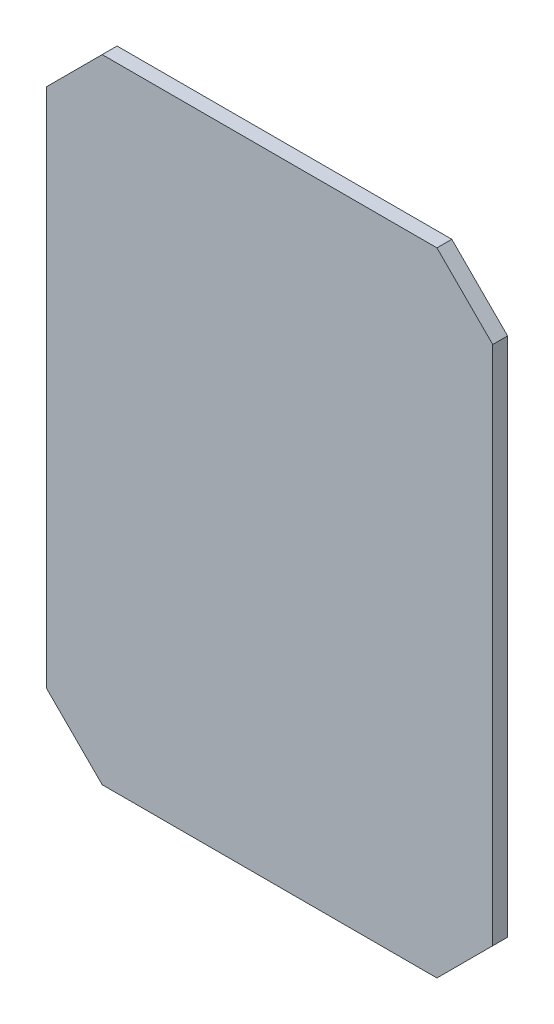
ISO-10303-21;
HEADER;
FILE_DESCRIPTION(('STEP AP214'),'2;1');
FILE_NAME('part.step','',(''),(''),'','','');
FILE_SCHEMA(('AUTOMOTIVE_DESIGN { 1 0 10303 214 1 1 1 1 }'));
ENDSEC;
DATA;
#1=APPLICATION_CONTEXT('core data for automotive mechanical design processes');
#2=APPLICATION_PROTOCOL_DEFINITION('international standard','automotive_design',2000,#1);
#3=PRODUCT_CONTEXT('',#1,'mechanical');
#4=PRODUCT('Part','Part','',(#3));
#5=PRODUCT_RELATED_PRODUCT_CATEGORY('part','',(#4));
#6=PRODUCT_DEFINITION_FORMATION('','',#4);
#7=PRODUCT_DEFINITION_CONTEXT('part definition',#1,'design');
#8=PRODUCT_DEFINITION('design','',#6,#7);
#9=PRODUCT_DEFINITION_SHAPE('','',#8);
#10=(LENGTH_UNIT() NAMED_UNIT(*) SI_UNIT(.MILLI.,.METRE.));
#11=(NAMED_UNIT(*) PLANE_ANGLE_UNIT() SI_UNIT($,.RADIAN.));
#12=(NAMED_UNIT(*) SI_UNIT($,.STERADIAN.) SOLID_ANGLE_UNIT());
#13=UNCERTAINTY_MEASURE_WITH_UNIT(LENGTH_MEASURE(1.E-05),#10,'distance_accuracy_value','');
#14=(GEOMETRIC_REPRESENTATION_CONTEXT(3) GLOBAL_UNCERTAINTY_ASSIGNED_CONTEXT((#13)) GLOBAL_UNIT_ASSIGNED_CONTEXT((#10,
#11,#12)) REPRESENTATION_CONTEXT('',''));
#15=CARTESIAN_POINT('',(0.,0.,0.));
#16=DIRECTION('',(0.,0.,1.));
#17=DIRECTION('',(1.,0.,0.));
#18=AXIS2_PLACEMENT_3D('',#15,#16,#17);
#19=CARTESIAN_POINT('',(-95.9078770659767,78.0205879464951,8.));
#20=DIRECTION('',(-0.707106781186547,0.707106781186547,0.));
#21=DIRECTION('',(-0.707106781186548,-0.707106781186548,0.));
#22=AXIS2_PLACEMENT_3D('',#19,#20,#21);
#23=PLANE('',#22);
#24=DIRECTION('',(0.707106781186547,0.707106781186547,0.));
#25=VECTOR('',#24,1.);
#26=CARTESIAN_POINT('',(-95.9078770659767,78.0205879464951,0.));
#27=LINE('',#26,#25);
#28=CARTESIAN_POINT('',(-95.9078770659767,78.0205879464951,0.));
#29=VERTEX_POINT('',#28);
#30=CARTESIAN_POINT('',(-65.9078770659767,108.020587946495,0.));
#31=VERTEX_POINT('',#30);
#32=EDGE_CURVE('E135',#29,#31,#27,.T.);
#33=ORIENTED_EDGE('',*,*,#32,.F.);
#34=DIRECTION('',(0.,0.,-1.));
#35=VECTOR('',#34,1.);
#36=CARTESIAN_POINT('',(-95.9078770659767,78.0205879464951,8.));
#37=LINE('',#36,#35);
#38=CARTESIAN_POINT('',(-95.9078770659767,78.0205879464951,8.));
#39=VERTEX_POINT('',#38);
#40=EDGE_CURVE('E11',#39,#29,#37,.T.);
#41=ORIENTED_EDGE('',*,*,#40,.F.);
#42=DIRECTION('',(0.707106781186547,0.707106781186547,0.));
#43=VECTOR('',#42,1.);
#44=CARTESIAN_POINT('',(-95.9078770659767,78.0205879464951,8.));
#45=LINE('',#44,#43);
#46=CARTESIAN_POINT('',(-65.9078770659767,108.020587946495,8.));
#47=VERTEX_POINT('',#46);
#48=EDGE_CURVE('E153',#39,#47,#45,.T.);
#49=ORIENTED_EDGE('',*,*,#48,.T.);
#50=DIRECTION('',(0.,0.,-1.));
#51=VECTOR('',#50,1.);
#52=CARTESIAN_POINT('',(-65.9078770659767,108.020587946495,8.));
#53=LINE('',#52,#51);
#54=EDGE_CURVE('E39',#47,#31,#53,.T.);
#55=ORIENTED_EDGE('',*,*,#54,.T.);
#56=EDGE_LOOP('',(#33,#41,#49,#55));
#57=FACE_BOUND('',#56,.T.);
#58=ADVANCED_FACE('F36',(#57),#23,.T.);
#59=CARTESIAN_POINT('',(-95.9078770659767,78.0205879464951,8.));
#60=DIRECTION('',(1.,0.,0.));
#61=DIRECTION('',(0.,1.,0.));
#62=AXIS2_PLACEMENT_3D('',#59,#60,#61);
#63=PLANE('',#62);
#64=DIRECTION('',(0.,-1.,0.));
#65=VECTOR('',#64,1.);
#66=CARTESIAN_POINT('',(-95.9078770659767,78.0205879464951,0.));
#67=LINE('',#66,#65);
#68=CARTESIAN_POINT('',(-95.9078770659767,-201.979412053505,0.));
#69=VERTEX_POINT('',#68);
#70=EDGE_CURVE('E81',#29,#69,#67,.T.);
#71=ORIENTED_EDGE('',*,*,#70,.T.);
#72=DIRECTION('',(0.,0.,-1.));
#73=VECTOR('',#72,1.);
#74=CARTESIAN_POINT('',(-95.9078770659767,-201.979412053505,8.));
#75=LINE('',#74,#73);
#76=CARTESIAN_POINT('',(-95.9078770659767,-201.979412053505,8.));
#77=VERTEX_POINT('',#76);
#78=EDGE_CURVE('E45',#77,#69,#75,.T.);
#79=ORIENTED_EDGE('',*,*,#78,.F.);
#80=DIRECTION('',(0.,-1.,0.));
#81=VECTOR('',#80,1.);
#82=CARTESIAN_POINT('',(-95.9078770659767,78.0205879464951,8.));
#83=LINE('',#82,#81);
#84=EDGE_CURVE('E113',#39,#77,#83,.T.);
#85=ORIENTED_EDGE('',*,*,#84,.F.);
#86=ORIENTED_EDGE('',*,*,#40,.T.);
#87=EDGE_LOOP('',(#71,#79,#85,#86));
#88=FACE_BOUND('',#87,.T.);
#89=ADVANCED_FACE('F190',(#88),#63,.F.);
#90=CARTESIAN_POINT('',(-95.9078770659767,-201.979412053505,8.));
#91=DIRECTION('',(0.707106781186547,0.707106781186547,0.));
#92=DIRECTION('',(-0.707106781186548,0.707106781186548,0.));
#93=AXIS2_PLACEMENT_3D('',#90,#91,#92);
#94=PLANE('',#93);
#95=DIRECTION('',(0.707106781186547,-0.707106781186547,0.));
#96=VECTOR('',#95,1.);
#97=CARTESIAN_POINT('',(-95.9078770659767,-201.979412053505,0.));
#98=LINE('',#97,#96);
#99=CARTESIAN_POINT('',(-65.9078770659767,-231.979412053505,0.));
#100=VERTEX_POINT('',#99);
#101=EDGE_CURVE('E120',#69,#100,#98,.T.);
#102=ORIENTED_EDGE('',*,*,#101,.T.);
#103=DIRECTION('',(0.,0.,-1.));
#104=VECTOR('',#103,1.);
#105=CARTESIAN_POINT('',(-65.9078770659767,-231.979412053505,8.));
#106=LINE('',#105,#104);
#107=CARTESIAN_POINT('',(-65.9078770659767,-231.979412053505,8.));
#108=VERTEX_POINT('',#107);
#109=EDGE_CURVE('E117',#108,#100,#106,.T.);
#110=ORIENTED_EDGE('',*,*,#109,.F.);
#111=DIRECTION('',(0.707106781186547,-0.707106781186547,0.));
#112=VECTOR('',#111,1.);
#113=CARTESIAN_POINT('',(-95.9078770659767,-201.979412053505,8.));
#114=LINE('',#113,#112);
#115=EDGE_CURVE('E105',#77,#108,#114,.T.);
#116=ORIENTED_EDGE('',*,*,#115,.F.);
#117=ORIENTED_EDGE('',*,*,#78,.T.);
#118=EDGE_LOOP('',(#102,#110,#116,#117));
#119=FACE_BOUND('',#118,.T.);
#120=ADVANCED_FACE('F118',(#119),#94,.F.);
#121=CARTESIAN_POINT('',(-65.9078770659767,-231.979412053505,8.));
#122=DIRECTION('',(0.,1.,0.));
#123=DIRECTION('',(-1.,0.,0.));
#124=AXIS2_PLACEMENT_3D('',#121,#122,#123);
#125=PLANE('',#124);
#126=DIRECTION('',(1.,0.,0.));
#127=VECTOR('',#126,1.);
#128=CARTESIAN_POINT('',(-65.9078770659767,-231.979412053505,0.));
#129=LINE('',#128,#127);
#130=CARTESIAN_POINT('',(114.092122934023,-231.979412053505,0.));
#131=VERTEX_POINT('',#130);
#132=EDGE_CURVE('E150',#100,#131,#129,.T.);
#133=ORIENTED_EDGE('',*,*,#132,.T.);
#134=DIRECTION('',(0.,0.,-1.));
#135=VECTOR('',#134,1.);
#136=CARTESIAN_POINT('',(114.092122934023,-231.979412053505,8.));
#137=LINE('',#136,#135);
#138=CARTESIAN_POINT('',(114.092122934023,-231.979412053505,8.));
#139=VERTEX_POINT('',#138);
#140=EDGE_CURVE('E124',#139,#131,#137,.T.);
#141=ORIENTED_EDGE('',*,*,#140,.F.);
#142=DIRECTION('',(1.,0.,0.));
#143=VECTOR('',#142,1.);
#144=CARTESIAN_POINT('',(-65.9078770659767,-231.979412053505,8.));
#145=LINE('',#144,#143);
#146=EDGE_CURVE('E111',#108,#139,#145,.T.);
#147=ORIENTED_EDGE('',*,*,#146,.F.);
#148=ORIENTED_EDGE('',*,*,#109,.T.);
#149=EDGE_LOOP('',(#133,#141,#147,#148));
#150=FACE_BOUND('',#149,.T.);
#151=ADVANCED_FACE('F126',(#150),#125,.F.);
#152=CARTESIAN_POINT('',(144.092122934023,-201.979412053505,8.));
#153=DIRECTION('',(0.707106781186547,-0.707106781186547,0.));
#154=DIRECTION('',(0.707106781186548,0.707106781186548,0.));
#155=AXIS2_PLACEMENT_3D('',#152,#153,#154);
#156=PLANE('',#155);
#157=DIRECTION('',(-0.707106781186547,-0.707106781186547,0.));
#158=VECTOR('',#157,1.);
#159=CARTESIAN_POINT('',(144.092122934023,-201.979412053505,0.));
#160=LINE('',#159,#158);
#161=CARTESIAN_POINT('',(144.092122934023,-201.979412053505,0.));
#162=VERTEX_POINT('',#161);
#163=EDGE_CURVE('E147',#162,#131,#160,.T.);
#164=ORIENTED_EDGE('',*,*,#163,.F.);
#165=DIRECTION('',(0.,0.,-1.));
#166=VECTOR('',#165,1.);
#167=CARTESIAN_POINT('',(144.092122934023,-201.979412053505,8.));
#168=LINE('',#167,#166);
#169=CARTESIAN_POINT('',(144.092122934023,-201.979412053505,8.));
#170=VERTEX_POINT('',#169);
#171=EDGE_CURVE('E157',#170,#162,#168,.T.);
#172=ORIENTED_EDGE('',*,*,#171,.F.);
#173=DIRECTION('',(-0.707106781186547,-0.707106781186547,0.));
#174=VECTOR('',#173,1.);
#175=CARTESIAN_POINT('',(144.092122934023,-201.979412053505,8.));
#176=LINE('',#175,#174);
#177=EDGE_CURVE('E128',#170,#139,#176,.T.);
#178=ORIENTED_EDGE('',*,*,#177,.T.);
#179=ORIENTED_EDGE('',*,*,#140,.T.);
#180=EDGE_LOOP('',(#164,#172,#178,#179));
#181=FACE_BOUND('',#180,.T.);
#182=ADVANCED_FACE('F168',(#181),#156,.T.);
#183=CARTESIAN_POINT('',(144.092122934023,78.0205879464951,8.));
#184=DIRECTION('',(1.,0.,0.));
#185=DIRECTION('',(0.,1.,0.));
#186=AXIS2_PLACEMENT_3D('',#183,#184,#185);
#187=PLANE('',#186);
#188=DIRECTION('',(0.,-1.,0.));
#189=VECTOR('',#188,1.);
#190=CARTESIAN_POINT('',(144.092122934023,78.0205879464951,0.));
#191=LINE('',#190,#189);
#192=CARTESIAN_POINT('',(144.092122934023,78.0205879464951,0.));
#193=VERTEX_POINT('',#192);
#194=EDGE_CURVE('E144',#193,#162,#191,.T.);
#195=ORIENTED_EDGE('',*,*,#194,.F.);
#196=DIRECTION('',(0.,0.,-1.));
#197=VECTOR('',#196,1.);
#198=CARTESIAN_POINT('',(144.092122934023,78.0205879464951,8.));
#199=LINE('',#198,#197);
#200=CARTESIAN_POINT('',(144.092122934023,78.0205879464951,8.));
#201=VERTEX_POINT('',#200);
#202=EDGE_CURVE('E159',#201,#193,#199,.T.);
#203=ORIENTED_EDGE('',*,*,#202,.F.);
#204=DIRECTION('',(0.,-1.,0.));
#205=VECTOR('',#204,1.);
#206=CARTESIAN_POINT('',(144.092122934023,78.0205879464951,8.));
#207=LINE('',#206,#205);
#208=EDGE_CURVE('E130',#201,#170,#207,.T.);
#209=ORIENTED_EDGE('',*,*,#208,.T.);
#210=ORIENTED_EDGE('',*,*,#171,.T.);
#211=EDGE_LOOP('',(#195,#203,#209,#210));
#212=FACE_BOUND('',#211,.T.);
#213=ADVANCED_FACE('F174',(#212),#187,.T.);
#214=CARTESIAN_POINT('',(114.092122934023,108.020587946495,8.));
#215=DIRECTION('',(0.707106781186547,0.707106781186547,0.));
#216=DIRECTION('',(-0.707106781186548,0.707106781186548,0.));
#217=AXIS2_PLACEMENT_3D('',#214,#215,#216);
#218=PLANE('',#217);
#219=DIRECTION('',(0.707106781186547,-0.707106781186547,0.));
#220=VECTOR('',#219,1.);
#221=CARTESIAN_POINT('',(114.092122934023,108.020587946495,0.));
#222=LINE('',#221,#220);
#223=CARTESIAN_POINT('',(114.092122934023,108.020587946495,0.));
#224=VERTEX_POINT('',#223);
#225=EDGE_CURVE('E141',#224,#193,#222,.T.);
#226=ORIENTED_EDGE('',*,*,#225,.F.);
#227=DIRECTION('',(0.,0.,-1.));
#228=VECTOR('',#227,1.);
#229=CARTESIAN_POINT('',(114.092122934023,108.020587946495,8.));
#230=LINE('',#229,#228);
#231=CARTESIAN_POINT('',(114.092122934023,108.020587946495,8.));
#232=VERTEX_POINT('',#231);
#233=EDGE_CURVE('E160',#232,#224,#230,.T.);
#234=ORIENTED_EDGE('',*,*,#233,.F.);
#235=DIRECTION('',(0.707106781186547,-0.707106781186547,0.));
#236=VECTOR('',#235,1.);
#237=CARTESIAN_POINT('',(114.092122934023,108.020587946495,8.));
#238=LINE('',#237,#236);
#239=EDGE_CURVE('E175',#232,#201,#238,.T.);
#240=ORIENTED_EDGE('',*,*,#239,.T.);
#241=ORIENTED_EDGE('',*,*,#202,.T.);
#242=EDGE_LOOP('',(#226,#234,#240,#241));
#243=FACE_BOUND('',#242,.T.);
#244=ADVANCED_FACE('F181',(#243),#218,.T.);
#245=CARTESIAN_POINT('',(-65.9078770659767,108.020587946495,8.));
#246=DIRECTION('',(0.,1.,0.));
#247=DIRECTION('',(0.,0.,1.));
#248=AXIS2_PLACEMENT_3D('',#245,#246,#247);
#249=PLANE('',#248);
#250=DIRECTION('',(1.,0.,0.));
#251=VECTOR('',#250,1.);
#252=CARTESIAN_POINT('',(-65.9078770659767,108.020587946495,0.));
#253=LINE('',#252,#251);
#254=EDGE_CURVE('E138',#31,#224,#253,.T.);
#255=ORIENTED_EDGE('',*,*,#254,.F.);
#256=ORIENTED_EDGE('',*,*,#54,.F.);
#257=DIRECTION('',(1.,0.,0.));
#258=VECTOR('',#257,1.);
#259=CARTESIAN_POINT('',(-65.9078770659767,108.020587946495,8.));
#260=LINE('',#259,#258);
#261=EDGE_CURVE('E176',#47,#232,#260,.T.);
#262=ORIENTED_EDGE('',*,*,#261,.T.);
#263=ORIENTED_EDGE('',*,*,#233,.T.);
#264=EDGE_LOOP('',(#255,#256,#262,#263));
#265=FACE_BOUND('',#264,.T.);
#266=ADVANCED_FACE('F162',(#265),#249,.T.);
#267=CARTESIAN_POINT('',(0.,0.,8.));
#268=DIRECTION('',(0.,0.,-1.));
#269=DIRECTION('',(-1.,0.,0.));
#270=AXIS2_PLACEMENT_3D('',#267,#268,#269);
#271=PLANE('',#270);
#272=ORIENTED_EDGE('',*,*,#48,.F.);
#273=ORIENTED_EDGE('',*,*,#84,.T.);
#274=ORIENTED_EDGE('',*,*,#115,.T.);
#275=ORIENTED_EDGE('',*,*,#146,.T.);
#276=ORIENTED_EDGE('',*,*,#177,.F.);
#277=ORIENTED_EDGE('',*,*,#208,.F.);
#278=ORIENTED_EDGE('',*,*,#239,.F.);
#279=ORIENTED_EDGE('',*,*,#261,.F.);
#280=EDGE_LOOP('',(#272,#273,#274,#275,#276,#277,#278,#279));
#281=FACE_BOUND('',#280,.T.);
#282=ADVANCED_FACE('F108',(#281),#271,.F.);
#283=CARTESIAN_POINT('',(0.,0.,0.));
#284=DIRECTION('',(0.,0.,-1.));
#285=DIRECTION('',(-1.,0.,0.));
#286=AXIS2_PLACEMENT_3D('',#283,#284,#285);
#287=PLANE('',#286);
#288=ORIENTED_EDGE('',*,*,#32,.T.);
#289=ORIENTED_EDGE('',*,*,#254,.T.);
#290=ORIENTED_EDGE('',*,*,#225,.T.);
#291=ORIENTED_EDGE('',*,*,#194,.T.);
#292=ORIENTED_EDGE('',*,*,#163,.T.);
#293=ORIENTED_EDGE('',*,*,#132,.F.);
#294=ORIENTED_EDGE('',*,*,#101,.F.);
#295=ORIENTED_EDGE('',*,*,#70,.F.);
#296=EDGE_LOOP('',(#288,#289,#290,#291,#292,#293,#294,#295));
#297=FACE_BOUND('',#296,.T.);
#298=ADVANCED_FACE('F164',(#297),#287,.T.);
#299=CLOSED_SHELL('',(#58,#89,#120,#151,#182,#213,#244,#266,#282,#298));
#300=MANIFOLD_SOLID_BREP('B2',#299);
#301=ADVANCED_BREP_SHAPE_REPRESENTATION('',(#18,#300),#14);
#302=SHAPE_DEFINITION_REPRESENTATION(#9,#301);
ENDSEC;
END-ISO-10303-21;
